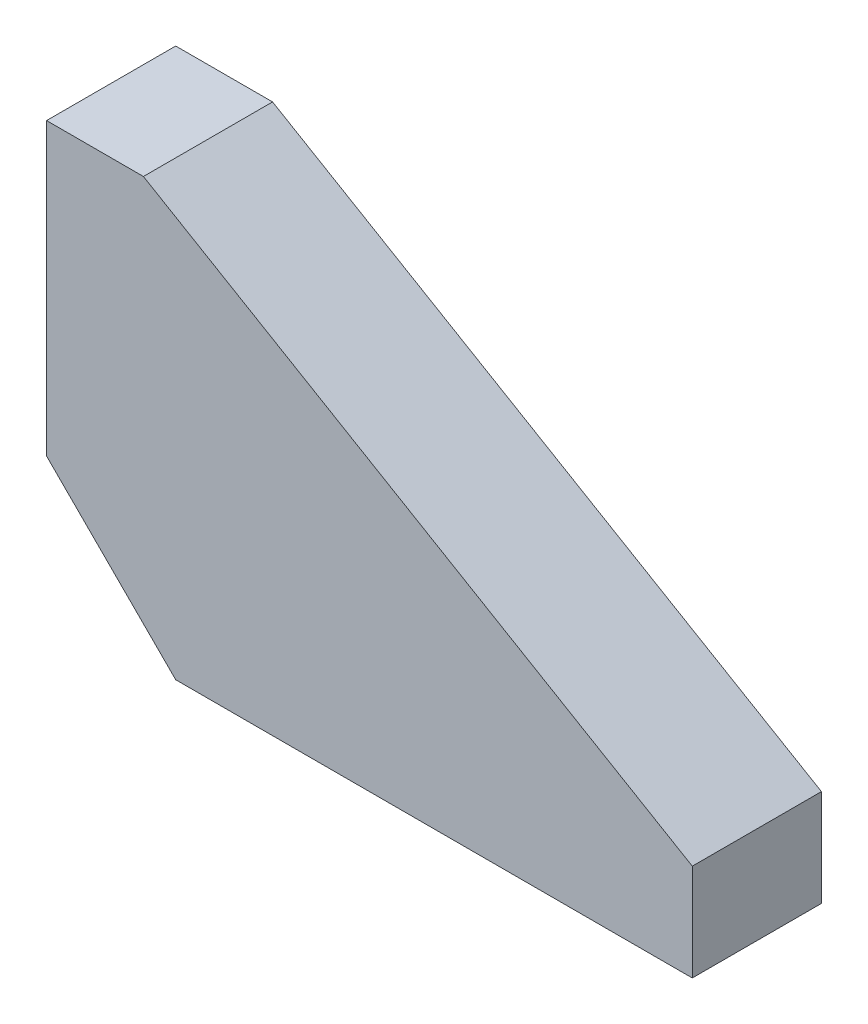
ISO-10303-21;
HEADER;
FILE_DESCRIPTION(('STEP AP214'),'2;1');
FILE_NAME('part.step','',(''),(''),'','','');
FILE_SCHEMA(('AUTOMOTIVE_DESIGN { 1 0 10303 214 1 1 1 1 }'));
ENDSEC;
DATA;
#1=APPLICATION_CONTEXT('core data for automotive mechanical design processes');
#2=APPLICATION_PROTOCOL_DEFINITION('international standard','automotive_design',2000,#1);
#3=PRODUCT_CONTEXT('',#1,'mechanical');
#4=PRODUCT('Part','Part','',(#3));
#5=PRODUCT_RELATED_PRODUCT_CATEGORY('part','',(#4));
#6=PRODUCT_DEFINITION_FORMATION('','',#4);
#7=PRODUCT_DEFINITION_CONTEXT('part definition',#1,'design');
#8=PRODUCT_DEFINITION('design','',#6,#7);
#9=PRODUCT_DEFINITION_SHAPE('','',#8);
#10=(LENGTH_UNIT() NAMED_UNIT(*) SI_UNIT(.MILLI.,.METRE.));
#11=(NAMED_UNIT(*) PLANE_ANGLE_UNIT() SI_UNIT($,.RADIAN.));
#12=(NAMED_UNIT(*) SI_UNIT($,.STERADIAN.) SOLID_ANGLE_UNIT());
#13=UNCERTAINTY_MEASURE_WITH_UNIT(LENGTH_MEASURE(1.E-05),#10,'distance_accuracy_value','');
#14=(GEOMETRIC_REPRESENTATION_CONTEXT(3) GLOBAL_UNCERTAINTY_ASSIGNED_CONTEXT((#13)) GLOBAL_UNIT_ASSIGNED_CONTEXT((#10,
#11,#12)) REPRESENTATION_CONTEXT('',''));
#15=CARTESIAN_POINT('',(0.,0.,0.));
#16=DIRECTION('',(0.,0.,1.));
#17=DIRECTION('',(1.,0.,0.));
#18=AXIS2_PLACEMENT_3D('',#15,#16,#17);
#19=CARTESIAN_POINT('',(0.,-45.,20.));
#20=DIRECTION('',(1.,0.,0.));
#21=DIRECTION('',(0.,0.,-1.));
#22=AXIS2_PLACEMENT_3D('',#19,#20,#21);
#23=PLANE('',#22);
#24=DIRECTION('',(0.,-1.,0.));
#25=VECTOR('',#24,1.);
#26=CARTESIAN_POINT('',(0.,-45.,0.));
#27=LINE('',#26,#25);
#28=CARTESIAN_POINT('',(0.,0.,0.));
#29=VERTEX_POINT('',#28);
#30=CARTESIAN_POINT('',(0.,-45.,0.));
#31=VERTEX_POINT('',#30);
#32=EDGE_CURVE('E119',#29,#31,#27,.T.);
#33=ORIENTED_EDGE('',*,*,#32,.T.);
#34=DIRECTION('',(0.,0.,-1.));
#35=VECTOR('',#34,1.);
#36=CARTESIAN_POINT('',(0.,-45.,20.));
#37=LINE('',#36,#35);
#38=CARTESIAN_POINT('',(0.,-45.,20.));
#39=VERTEX_POINT('',#38);
#40=EDGE_CURVE('E11',#39,#31,#37,.T.);
#41=ORIENTED_EDGE('',*,*,#40,.F.);
#42=DIRECTION('',(0.,-1.,0.));
#43=VECTOR('',#42,1.);
#44=CARTESIAN_POINT('',(0.,-45.,20.));
#45=LINE('',#44,#43);
#46=CARTESIAN_POINT('',(0.,0.,20.));
#47=VERTEX_POINT('',#46);
#48=EDGE_CURVE('E129',#47,#39,#45,.T.);
#49=ORIENTED_EDGE('',*,*,#48,.F.);
#50=DIRECTION('',(0.,0.,-1.));
#51=VECTOR('',#50,1.);
#52=CARTESIAN_POINT('',(0.,0.,20.));
#53=LINE('',#52,#51);
#54=EDGE_CURVE('E115',#47,#29,#53,.T.);
#55=ORIENTED_EDGE('',*,*,#54,.T.);
#56=EDGE_LOOP('',(#33,#41,#49,#55));
#57=FACE_BOUND('',#56,.T.);
#58=ADVANCED_FACE('F35',(#57),#23,.F.);
#59=CARTESIAN_POINT('',(20.,-65.,20.));
#60=DIRECTION('',(0.707106781186548,0.707106781186547,0.));
#61=DIRECTION('',(-0.707106781186547,0.707106781186548,0.));
#62=AXIS2_PLACEMENT_3D('',#59,#60,#61);
#63=PLANE('',#62);
#64=DIRECTION('',(0.707106781186547,-0.707106781186548,0.));
#65=VECTOR('',#64,1.);
#66=CARTESIAN_POINT('',(20.,-65.,0.));
#67=LINE('',#66,#65);
#68=CARTESIAN_POINT('',(20.,-65.,0.));
#69=VERTEX_POINT('',#68);
#70=EDGE_CURVE('E122',#31,#69,#67,.T.);
#71=ORIENTED_EDGE('',*,*,#70,.T.);
#72=DIRECTION('',(0.,0.,-1.));
#73=VECTOR('',#72,1.);
#74=CARTESIAN_POINT('',(20.,-65.,20.));
#75=LINE('',#74,#73);
#76=CARTESIAN_POINT('',(20.,-65.,20.));
#77=VERTEX_POINT('',#76);
#78=EDGE_CURVE('E43',#77,#69,#75,.T.);
#79=ORIENTED_EDGE('',*,*,#78,.F.);
#80=DIRECTION('',(0.707106781186547,-0.707106781186548,0.));
#81=VECTOR('',#80,1.);
#82=CARTESIAN_POINT('',(20.,-65.,20.));
#83=LINE('',#82,#81);
#84=EDGE_CURVE('E88',#39,#77,#83,.T.);
#85=ORIENTED_EDGE('',*,*,#84,.F.);
#86=ORIENTED_EDGE('',*,*,#40,.T.);
#87=EDGE_LOOP('',(#71,#79,#85,#86));
#88=FACE_BOUND('',#87,.T.);
#89=ADVANCED_FACE('F153',(#88),#63,.F.);
#90=CARTESIAN_POINT('',(100.,-65.,20.));
#91=DIRECTION('',(0.,1.,0.));
#92=DIRECTION('',(-1.,0.,0.));
#93=AXIS2_PLACEMENT_3D('',#90,#91,#92);
#94=PLANE('',#93);
#95=DIRECTION('',(1.,0.,0.));
#96=VECTOR('',#95,1.);
#97=CARTESIAN_POINT('',(100.,-65.,0.));
#98=LINE('',#97,#96);
#99=CARTESIAN_POINT('',(100.,-65.,0.));
#100=VERTEX_POINT('',#99);
#101=EDGE_CURVE('E124',#69,#100,#98,.T.);
#102=ORIENTED_EDGE('',*,*,#101,.T.);
#103=DIRECTION('',(0.,0.,-1.));
#104=VECTOR('',#103,1.);
#105=CARTESIAN_POINT('',(100.,-65.,20.));
#106=LINE('',#105,#104);
#107=CARTESIAN_POINT('',(100.,-65.,20.));
#108=VERTEX_POINT('',#107);
#109=EDGE_CURVE('E110',#108,#100,#106,.T.);
#110=ORIENTED_EDGE('',*,*,#109,.F.);
#111=DIRECTION('',(1.,0.,0.));
#112=VECTOR('',#111,1.);
#113=CARTESIAN_POINT('',(100.,-65.,20.));
#114=LINE('',#113,#112);
#115=EDGE_CURVE('E101',#77,#108,#114,.T.);
#116=ORIENTED_EDGE('',*,*,#115,.F.);
#117=ORIENTED_EDGE('',*,*,#78,.T.);
#118=EDGE_LOOP('',(#102,#110,#116,#117));
#119=FACE_BOUND('',#118,.T.);
#120=ADVANCED_FACE('F135',(#119),#94,.F.);
#121=CARTESIAN_POINT('',(100.,-50.,20.));
#122=DIRECTION('',(-1.,0.,0.));
#123=DIRECTION('',(0.,0.,1.));
#124=AXIS2_PLACEMENT_3D('',#121,#122,#123);
#125=PLANE('',#124);
#126=DIRECTION('',(0.,1.,0.));
#127=VECTOR('',#126,1.);
#128=CARTESIAN_POINT('',(100.,-50.,0.));
#129=LINE('',#128,#127);
#130=CARTESIAN_POINT('',(100.,-50.,0.));
#131=VERTEX_POINT('',#130);
#132=EDGE_CURVE('E109',#100,#131,#129,.T.);
#133=ORIENTED_EDGE('',*,*,#132,.T.);
#134=DIRECTION('',(0.,0.,-1.));
#135=VECTOR('',#134,1.);
#136=CARTESIAN_POINT('',(100.,-50.,20.));
#137=LINE('',#136,#135);
#138=CARTESIAN_POINT('',(100.,-50.,20.));
#139=VERTEX_POINT('',#138);
#140=EDGE_CURVE('E106',#139,#131,#137,.T.);
#141=ORIENTED_EDGE('',*,*,#140,.F.);
#142=DIRECTION('',(0.,1.,0.));
#143=VECTOR('',#142,1.);
#144=CARTESIAN_POINT('',(100.,-50.,20.));
#145=LINE('',#144,#143);
#146=EDGE_CURVE('E95',#108,#139,#145,.T.);
#147=ORIENTED_EDGE('',*,*,#146,.F.);
#148=ORIENTED_EDGE('',*,*,#109,.T.);
#149=EDGE_LOOP('',(#133,#141,#147,#148));
#150=FACE_BOUND('',#149,.T.);
#151=ADVANCED_FACE('F107',(#150),#125,.F.);
#152=CARTESIAN_POINT('',(15.,0.,20.));
#153=DIRECTION('',(-0.507020126563394,-0.861934215157769,0.));
#154=DIRECTION('',(0.86193421515777,-0.507020126563394,0.));
#155=AXIS2_PLACEMENT_3D('',#152,#153,#154);
#156=PLANE('',#155);
#157=DIRECTION('',(-0.861934215157769,0.507020126563394,0.));
#158=VECTOR('',#157,1.);
#159=CARTESIAN_POINT('',(15.,0.,0.));
#160=LINE('',#159,#158);
#161=CARTESIAN_POINT('',(15.,0.,0.));
#162=VERTEX_POINT('',#161);
#163=EDGE_CURVE('E74',#131,#162,#160,.T.);
#164=ORIENTED_EDGE('',*,*,#163,.T.);
#165=DIRECTION('',(0.,0.,-1.));
#166=VECTOR('',#165,1.);
#167=CARTESIAN_POINT('',(15.,0.,20.));
#168=LINE('',#167,#166);
#169=CARTESIAN_POINT('',(15.,0.,20.));
#170=VERTEX_POINT('',#169);
#171=EDGE_CURVE('E111',#170,#162,#168,.T.);
#172=ORIENTED_EDGE('',*,*,#171,.F.);
#173=DIRECTION('',(-0.861934215157769,0.507020126563394,0.));
#174=VECTOR('',#173,1.);
#175=CARTESIAN_POINT('',(15.,0.,20.));
#176=LINE('',#175,#174);
#177=EDGE_CURVE('E99',#139,#170,#176,.T.);
#178=ORIENTED_EDGE('',*,*,#177,.F.);
#179=ORIENTED_EDGE('',*,*,#140,.T.);
#180=EDGE_LOOP('',(#164,#172,#178,#179));
#181=FACE_BOUND('',#180,.T.);
#182=ADVANCED_FACE('F113',(#181),#156,.F.);
#183=CARTESIAN_POINT('',(0.,0.,20.));
#184=DIRECTION('',(0.,-1.,0.));
#185=DIRECTION('',(0.,0.,-1.));
#186=AXIS2_PLACEMENT_3D('',#183,#184,#185);
#187=PLANE('',#186);
#188=DIRECTION('',(-1.,0.,0.));
#189=VECTOR('',#188,1.);
#190=CARTESIAN_POINT('',(0.,0.,0.));
#191=LINE('',#190,#189);
#192=EDGE_CURVE('E80',#162,#29,#191,.T.);
#193=ORIENTED_EDGE('',*,*,#192,.T.);
#194=ORIENTED_EDGE('',*,*,#54,.F.);
#195=DIRECTION('',(-1.,0.,0.));
#196=VECTOR('',#195,1.);
#197=CARTESIAN_POINT('',(0.,0.,20.));
#198=LINE('',#197,#196);
#199=EDGE_CURVE('E51',#170,#47,#198,.T.);
#200=ORIENTED_EDGE('',*,*,#199,.F.);
#201=ORIENTED_EDGE('',*,*,#171,.T.);
#202=EDGE_LOOP('',(#193,#194,#200,#201));
#203=FACE_BOUND('',#202,.T.);
#204=ADVANCED_FACE('F142',(#203),#187,.F.);
#205=CARTESIAN_POINT('',(0.,0.,20.));
#206=DIRECTION('',(0.,0.,-1.));
#207=DIRECTION('',(-1.,0.,0.));
#208=AXIS2_PLACEMENT_3D('',#205,#206,#207);
#209=PLANE('',#208);
#210=ORIENTED_EDGE('',*,*,#48,.T.);
#211=ORIENTED_EDGE('',*,*,#84,.T.);
#212=ORIENTED_EDGE('',*,*,#115,.T.);
#213=ORIENTED_EDGE('',*,*,#146,.T.);
#214=ORIENTED_EDGE('',*,*,#177,.T.);
#215=ORIENTED_EDGE('',*,*,#199,.T.);
#216=EDGE_LOOP('',(#210,#211,#212,#213,#214,#215));
#217=FACE_BOUND('',#216,.T.);
#218=ADVANCED_FACE('F97',(#217),#209,.F.);
#219=CARTESIAN_POINT('',(0.,0.,0.));
#220=DIRECTION('',(0.,0.,-1.));
#221=DIRECTION('',(-1.,0.,0.));
#222=AXIS2_PLACEMENT_3D('',#219,#220,#221);
#223=PLANE('',#222);
#224=ORIENTED_EDGE('',*,*,#32,.F.);
#225=ORIENTED_EDGE('',*,*,#192,.F.);
#226=ORIENTED_EDGE('',*,*,#163,.F.);
#227=ORIENTED_EDGE('',*,*,#132,.F.);
#228=ORIENTED_EDGE('',*,*,#101,.F.);
#229=ORIENTED_EDGE('',*,*,#70,.F.);
#230=EDGE_LOOP('',(#224,#225,#226,#227,#228,#229));
#231=FACE_BOUND('',#230,.T.);
#232=ADVANCED_FACE('F138',(#231),#223,.T.);
#233=CLOSED_SHELL('',(#58,#89,#120,#151,#182,#204,#218,#232));
#234=MANIFOLD_SOLID_BREP('B2',#233);
#235=ADVANCED_BREP_SHAPE_REPRESENTATION('',(#18,#234),#14);
#236=SHAPE_DEFINITION_REPRESENTATION(#9,#235);
ENDSEC;
END-ISO-10303-21;
